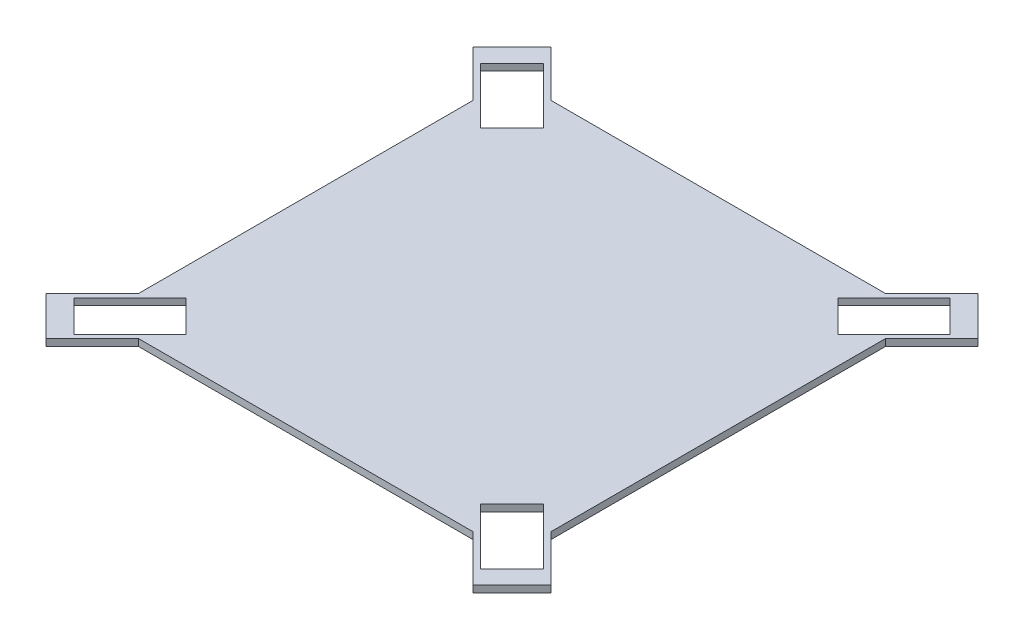
ISO-10303-21;
HEADER;
FILE_DESCRIPTION(('STEP AP214'),'2;1');
FILE_NAME('part.step','',(''),(''),'','','');
FILE_SCHEMA(('AUTOMOTIVE_DESIGN { 1 0 10303 214 1 1 1 1 }'));
ENDSEC;
DATA;
#1=APPLICATION_CONTEXT('core data for automotive mechanical design processes');
#2=APPLICATION_PROTOCOL_DEFINITION('international standard','automotive_design',2000,#1);
#3=PRODUCT_CONTEXT('',#1,'mechanical');
#4=PRODUCT('Part','Part','',(#3));
#5=PRODUCT_RELATED_PRODUCT_CATEGORY('part','',(#4));
#6=PRODUCT_DEFINITION_FORMATION('','',#4);
#7=PRODUCT_DEFINITION_CONTEXT('part definition',#1,'design');
#8=PRODUCT_DEFINITION('design','',#6,#7);
#9=PRODUCT_DEFINITION_SHAPE('','',#8);
#10=(LENGTH_UNIT() NAMED_UNIT(*) SI_UNIT(.MILLI.,.METRE.));
#11=(NAMED_UNIT(*) PLANE_ANGLE_UNIT() SI_UNIT($,.RADIAN.));
#12=(NAMED_UNIT(*) SI_UNIT($,.STERADIAN.) SOLID_ANGLE_UNIT());
#13=UNCERTAINTY_MEASURE_WITH_UNIT(LENGTH_MEASURE(1.E-05),#10,'distance_accuracy_value','');
#14=(GEOMETRIC_REPRESENTATION_CONTEXT(3) GLOBAL_UNCERTAINTY_ASSIGNED_CONTEXT((#13)) GLOBAL_UNIT_ASSIGNED_CONTEXT((#10,
#11,#12)) REPRESENTATION_CONTEXT('',''));
#15=CARTESIAN_POINT('',(0.,0.,0.));
#16=DIRECTION('',(0.,0.,1.));
#17=DIRECTION('',(1.,0.,0.));
#18=AXIS2_PLACEMENT_3D('',#15,#16,#17);
#19=CARTESIAN_POINT('',(0.,2.,0.));
#20=DIRECTION('',(0.,1.,0.));
#21=DIRECTION('',(0.,0.,1.));
#22=AXIS2_PLACEMENT_3D('',#19,#20,#21);
#23=PLANE('',#22);
#24=DIRECTION('',(-0.707106781186549,0.,0.707106781186546));
#25=VECTOR('',#24,1.);
#26=CARTESIAN_POINT('',(62.091199086055,2.,-73.4049075850395));
#27=LINE('',#26,#25);
#28=CARTESIAN_POINT('',(62.091199086055,2.,-73.4049075850395));
#29=VERTEX_POINT('',#28);
#30=CARTESIAN_POINT('',(48.6561702435106,2.,-59.9698787424951));
#31=VERTEX_POINT('',#30);
#32=EDGE_CURVE('E374',#29,#31,#27,.T.);
#33=ORIENTED_EDGE('',*,*,#32,.T.);
#34=DIRECTION('',(-1.,0.,0.));
#35=VECTOR('',#34,1.);
#36=CARTESIAN_POINT('',(48.6561702435106,2.,-59.9698787424951));
#37=LINE('',#36,#35);
#38=CARTESIAN_POINT('',(-48.6561702435106,2.,-59.9698787424951));
#39=VERTEX_POINT('',#38);
#40=EDGE_CURVE('E377',#31,#39,#37,.T.);
#41=ORIENTED_EDGE('',*,*,#40,.T.);
#42=DIRECTION('',(-0.707106781186549,0.,-0.707106781186546));
#43=VECTOR('',#42,1.);
#44=CARTESIAN_POINT('',(-62.091199086055,2.,-73.4049075850395));
#45=LINE('',#44,#43);
#46=CARTESIAN_POINT('',(-62.091199086055,2.,-73.4049075850395));
#47=VERTEX_POINT('',#46);
#48=EDGE_CURVE('E380',#39,#47,#45,.T.);
#49=ORIENTED_EDGE('',*,*,#48,.T.);
#50=DIRECTION('',(-0.707106781186546,0.,0.707106781186549));
#51=VECTOR('',#50,1.);
#52=CARTESIAN_POINT('',(-62.091199086055,2.,-73.4049075850395));
#53=LINE('',#52,#51);
#54=CARTESIAN_POINT('',(-73.4049075850398,2.,-62.0911990860547));
#55=VERTEX_POINT('',#54);
#56=EDGE_CURVE('E382',#47,#55,#53,.T.);
#57=ORIENTED_EDGE('',*,*,#56,.T.);
#58=DIRECTION('',(0.707106781186552,0.,0.707106781186543));
#59=VECTOR('',#58,1.);
#60=CARTESIAN_POINT('',(-73.4049075850398,2.,-62.0911990860547));
#61=LINE('',#60,#59);
#62=CARTESIAN_POINT('',(-59.9698787424953,2.,-48.6561702435104));
#63=VERTEX_POINT('',#62);
#64=EDGE_CURVE('E384',#55,#63,#61,.T.);
#65=ORIENTED_EDGE('',*,*,#64,.T.);
#66=DIRECTION('',(0.,0.,1.));
#67=VECTOR('',#66,1.);
#68=CARTESIAN_POINT('',(-59.9698787424953,2.,48.6561702435104));
#69=LINE('',#68,#67);
#70=CARTESIAN_POINT('',(-59.9698787424953,2.,48.6561702435104));
#71=VERTEX_POINT('',#70);
#72=EDGE_CURVE('E386',#63,#71,#69,.T.);
#73=ORIENTED_EDGE('',*,*,#72,.T.);
#74=DIRECTION('',(-0.707106781186552,0.,0.707106781186543));
#75=VECTOR('',#74,1.);
#76=CARTESIAN_POINT('',(-73.4049075850398,2.,62.0911990860547));
#77=LINE('',#76,#75);
#78=CARTESIAN_POINT('',(-73.4049075850398,2.,62.0911990860547));
#79=VERTEX_POINT('',#78);
#80=EDGE_CURVE('E388',#71,#79,#77,.T.);
#81=ORIENTED_EDGE('',*,*,#80,.T.);
#82=DIRECTION('',(0.707106781186546,0.,0.707106781186549));
#83=VECTOR('',#82,1.);
#84=CARTESIAN_POINT('',(-62.091199086055,2.,73.4049075850395));
#85=LINE('',#84,#83);
#86=CARTESIAN_POINT('',(-62.091199086055,2.,73.4049075850395));
#87=VERTEX_POINT('',#86);
#88=EDGE_CURVE('E390',#79,#87,#85,.T.);
#89=ORIENTED_EDGE('',*,*,#88,.T.);
#90=DIRECTION('',(0.707106781186549,0.,-0.707106781186546));
#91=VECTOR('',#90,1.);
#92=CARTESIAN_POINT('',(-62.091199086055,2.,73.4049075850395));
#93=LINE('',#92,#91);
#94=CARTESIAN_POINT('',(-48.6561702435106,2.,59.9698787424951));
#95=VERTEX_POINT('',#94);
#96=EDGE_CURVE('E392',#87,#95,#93,.T.);
#97=ORIENTED_EDGE('',*,*,#96,.T.);
#98=DIRECTION('',(1.,0.,0.));
#99=VECTOR('',#98,1.);
#100=CARTESIAN_POINT('',(48.6561702435106,2.,59.9698787424951));
#101=LINE('',#100,#99);
#102=CARTESIAN_POINT('',(48.6561702435106,2.,59.9698787424951));
#103=VERTEX_POINT('',#102);
#104=EDGE_CURVE('E394',#95,#103,#101,.T.);
#105=ORIENTED_EDGE('',*,*,#104,.T.);
#106=DIRECTION('',(0.707106781186549,0.,0.707106781186546));
#107=VECTOR('',#106,1.);
#108=CARTESIAN_POINT('',(62.091199086055,2.,73.4049075850395));
#109=LINE('',#108,#107);
#110=CARTESIAN_POINT('',(62.091199086055,2.,73.4049075850395));
#111=VERTEX_POINT('',#110);
#112=EDGE_CURVE('E396',#103,#111,#109,.T.);
#113=ORIENTED_EDGE('',*,*,#112,.T.);
#114=DIRECTION('',(0.707106781186546,0.,-0.707106781186549));
#115=VECTOR('',#114,1.);
#116=CARTESIAN_POINT('',(62.091199086055,2.,73.4049075850395));
#117=LINE('',#116,#115);
#118=CARTESIAN_POINT('',(73.4049075850398,2.,62.0911990860547));
#119=VERTEX_POINT('',#118);
#120=EDGE_CURVE('E398',#111,#119,#117,.T.);
#121=ORIENTED_EDGE('',*,*,#120,.T.);
#122=DIRECTION('',(-0.707106781186552,0.,-0.707106781186543));
#123=VECTOR('',#122,1.);
#124=CARTESIAN_POINT('',(73.4049075850398,2.,62.0911990860547));
#125=LINE('',#124,#123);
#126=CARTESIAN_POINT('',(59.9698787424953,2.,48.6561702435104));
#127=VERTEX_POINT('',#126);
#128=EDGE_CURVE('E400',#119,#127,#125,.T.);
#129=ORIENTED_EDGE('',*,*,#128,.T.);
#130=DIRECTION('',(0.,0.,-1.));
#131=VECTOR('',#130,1.);
#132=CARTESIAN_POINT('',(59.9698787424953,2.,48.6561702435104));
#133=LINE('',#132,#131);
#134=CARTESIAN_POINT('',(59.9698787424954,2.,-48.6561702435103));
#135=VERTEX_POINT('',#134);
#136=EDGE_CURVE('E402',#127,#135,#133,.T.);
#137=ORIENTED_EDGE('',*,*,#136,.T.);
#138=DIRECTION('',(0.707106781186547,0.,-0.707106781186547));
#139=VECTOR('',#138,1.);
#140=CARTESIAN_POINT('',(73.4049075850398,2.,-62.0911990860547));
#141=LINE('',#140,#139);
#142=CARTESIAN_POINT('',(73.4049075850398,2.,-62.0911990860547));
#143=VERTEX_POINT('',#142);
#144=EDGE_CURVE('E404',#135,#143,#141,.T.);
#145=ORIENTED_EDGE('',*,*,#144,.T.);
#146=DIRECTION('',(-0.707106781186546,0.,-0.707106781186549));
#147=VECTOR('',#146,1.);
#148=CARTESIAN_POINT('',(62.091199086055,2.,-73.4049075850395));
#149=LINE('',#148,#147);
#150=EDGE_CURVE('E406',#143,#29,#149,.T.);
#151=ORIENTED_EDGE('',*,*,#150,.T.);
#152=EDGE_LOOP('',(#33,#41,#49,#57,#65,#73,#81,#89,#97,#105,#113,#121,#129,#137,#145,#151));
#153=FACE_BOUND('',#152,.T.);
#154=DIRECTION('',(0.707106781186546,0.,0.707106781186549));
#155=VECTOR('',#154,1.);
#156=CARTESIAN_POINT('',(42.7871839596622,2.,-51.9795721150871));
#157=LINE('',#156,#155);
#158=CARTESIAN_POINT('',(42.7871839596622,2.,-51.9795721150871));
#159=VERTEX_POINT('',#158);
#160=CARTESIAN_POINT('',(51.9795721150873,2.,-42.787183959662));
#161=VERTEX_POINT('',#160);
#162=EDGE_CURVE('E345',#159,#161,#157,.T.);
#163=ORIENTED_EDGE('',*,*,#162,.F.);
#164=DIRECTION('',(-0.70710678118655,0.,0.707106781186545));
#165=VECTOR('',#164,1.);
#166=CARTESIAN_POINT('',(59.0506399269529,2.,-68.2430280823776));
#167=LINE('',#166,#165);
#168=CARTESIAN_POINT('',(59.0506399269529,2.,-68.2430280823776));
#169=VERTEX_POINT('',#168);
#170=EDGE_CURVE('E343',#169,#159,#167,.T.);
#171=ORIENTED_EDGE('',*,*,#170,.F.);
#172=DIRECTION('',(-0.707106781186547,0.,-0.707106781186548));
#173=VECTOR('',#172,1.);
#174=CARTESIAN_POINT('',(59.0506399269529,2.,-68.2430280823776));
#175=LINE('',#174,#173);
#176=CARTESIAN_POINT('',(68.2430280823779,2.,-59.0506399269526));
#177=VERTEX_POINT('',#176);
#178=EDGE_CURVE('E351',#177,#169,#175,.T.);
#179=ORIENTED_EDGE('',*,*,#178,.F.);
#180=DIRECTION('',(0.707106781186548,0.,-0.707106781186547));
#181=VECTOR('',#180,1.);
#182=CARTESIAN_POINT('',(68.2430280823779,2.,-59.0506399269526));
#183=LINE('',#182,#181);
#184=EDGE_CURVE('E348',#161,#177,#183,.T.);
#185=ORIENTED_EDGE('',*,*,#184,.F.);
#186=EDGE_LOOP('',(#163,#171,#179,#185));
#187=FACE_BOUND('',#186,.T.);
#188=DIRECTION('',(-0.707106781186548,0.,-0.707106781186547));
#189=VECTOR('',#188,1.);
#190=CARTESIAN_POINT('',(68.2430280823779,2.,59.0506399269526));
#191=LINE('',#190,#189);
#192=CARTESIAN_POINT('',(68.2430280823779,2.,59.0506399269526));
#193=VERTEX_POINT('',#192);
#194=CARTESIAN_POINT('',(51.9795721150873,2.,42.787183959662));
#195=VERTEX_POINT('',#194);
#196=EDGE_CURVE('E314',#193,#195,#191,.T.);
#197=ORIENTED_EDGE('',*,*,#196,.F.);
#198=DIRECTION('',(0.707106781186547,0.,-0.707106781186548));
#199=VECTOR('',#198,1.);
#200=CARTESIAN_POINT('',(59.0506399269529,2.,68.2430280823776));
#201=LINE('',#200,#199);
#202=CARTESIAN_POINT('',(59.0506399269529,2.,68.2430280823776));
#203=VERTEX_POINT('',#202);
#204=EDGE_CURVE('E312',#203,#193,#201,.T.);
#205=ORIENTED_EDGE('',*,*,#204,.F.);
#206=DIRECTION('',(0.70710678118655,0.,0.707106781186545));
#207=VECTOR('',#206,1.);
#208=CARTESIAN_POINT('',(59.0506399269529,2.,68.2430280823776));
#209=LINE('',#208,#207);
#210=CARTESIAN_POINT('',(42.7871839596622,2.,51.9795721150871));
#211=VERTEX_POINT('',#210);
#212=EDGE_CURVE('E320',#211,#203,#209,.T.);
#213=ORIENTED_EDGE('',*,*,#212,.F.);
#214=DIRECTION('',(-0.707106781186546,0.,0.707106781186549));
#215=VECTOR('',#214,1.);
#216=CARTESIAN_POINT('',(42.7871839596622,2.,51.9795721150871));
#217=LINE('',#216,#215);
#218=EDGE_CURVE('E317',#195,#211,#217,.T.);
#219=ORIENTED_EDGE('',*,*,#218,.F.);
#220=EDGE_LOOP('',(#197,#205,#213,#219));
#221=FACE_BOUND('',#220,.T.);
#222=DIRECTION('',(-0.707106781186546,0.,-0.707106781186549));
#223=VECTOR('',#222,1.);
#224=CARTESIAN_POINT('',(-42.7871839596622,2.,51.9795721150871));
#225=LINE('',#224,#223);
#226=CARTESIAN_POINT('',(-42.7871839596622,2.,51.9795721150871));
#227=VERTEX_POINT('',#226);
#228=CARTESIAN_POINT('',(-51.9795721150873,2.,42.787183959662));
#229=VERTEX_POINT('',#228);
#230=EDGE_CURVE('E283',#227,#229,#225,.T.);
#231=ORIENTED_EDGE('',*,*,#230,.F.);
#232=DIRECTION('',(0.70710678118655,0.,-0.707106781186545));
#233=VECTOR('',#232,1.);
#234=CARTESIAN_POINT('',(-59.0506399269529,2.,68.2430280823776));
#235=LINE('',#234,#233);
#236=CARTESIAN_POINT('',(-59.0506399269529,2.,68.2430280823776));
#237=VERTEX_POINT('',#236);
#238=EDGE_CURVE('E281',#237,#227,#235,.T.);
#239=ORIENTED_EDGE('',*,*,#238,.F.);
#240=DIRECTION('',(0.707106781186547,0.,0.707106781186548));
#241=VECTOR('',#240,1.);
#242=CARTESIAN_POINT('',(-59.0506399269529,2.,68.2430280823776));
#243=LINE('',#242,#241);
#244=CARTESIAN_POINT('',(-68.2430280823779,2.,59.0506399269526));
#245=VERTEX_POINT('',#244);
#246=EDGE_CURVE('E289',#245,#237,#243,.T.);
#247=ORIENTED_EDGE('',*,*,#246,.F.);
#248=DIRECTION('',(-0.707106781186548,0.,0.707106781186547));
#249=VECTOR('',#248,1.);
#250=CARTESIAN_POINT('',(-68.2430280823779,2.,59.0506399269526));
#251=LINE('',#250,#249);
#252=EDGE_CURVE('E286',#229,#245,#251,.T.);
#253=ORIENTED_EDGE('',*,*,#252,.F.);
#254=EDGE_LOOP('',(#231,#239,#247,#253));
#255=FACE_BOUND('',#254,.T.);
#256=DIRECTION('',(0.707106781186548,0.,0.707106781186547));
#257=VECTOR('',#256,1.);
#258=CARTESIAN_POINT('',(-68.2430280823779,2.,-59.0506399269526));
#259=LINE('',#258,#257);
#260=CARTESIAN_POINT('',(-68.2430280823779,2.,-59.0506399269526));
#261=VERTEX_POINT('',#260);
#262=CARTESIAN_POINT('',(-51.9795721150873,2.,-42.787183959662));
#263=VERTEX_POINT('',#262);
#264=EDGE_CURVE('E253',#261,#263,#259,.T.);
#265=ORIENTED_EDGE('',*,*,#264,.F.);
#266=DIRECTION('',(-0.707106781186547,0.,0.707106781186548));
#267=VECTOR('',#266,1.);
#268=CARTESIAN_POINT('',(-59.0506399269529,2.,-68.2430280823776));
#269=LINE('',#268,#267);
#270=CARTESIAN_POINT('',(-59.0506399269529,2.,-68.2430280823776));
#271=VERTEX_POINT('',#270);
#272=EDGE_CURVE('E245',#271,#261,#269,.T.);
#273=ORIENTED_EDGE('',*,*,#272,.F.);
#274=DIRECTION('',(-0.70710678118655,0.,-0.707106781186545));
#275=VECTOR('',#274,1.);
#276=CARTESIAN_POINT('',(-59.0506399269529,2.,-68.2430280823776));
#277=LINE('',#276,#275);
#278=CARTESIAN_POINT('',(-42.7871839596622,2.,-51.9795721150871));
#279=VERTEX_POINT('',#278);
#280=EDGE_CURVE('E267',#279,#271,#277,.T.);
#281=ORIENTED_EDGE('',*,*,#280,.F.);
#282=DIRECTION('',(0.707106781186546,0.,-0.707106781186549));
#283=VECTOR('',#282,1.);
#284=CARTESIAN_POINT('',(-42.7871839596622,2.,-51.9795721150871));
#285=LINE('',#284,#283);
#286=EDGE_CURVE('E265',#263,#279,#285,.T.);
#287=ORIENTED_EDGE('',*,*,#286,.F.);
#288=EDGE_LOOP('',(#265,#273,#281,#287));
#289=FACE_BOUND('',#288,.T.);
#290=ADVANCED_FACE('F36',(#153,#187,#221,#255,#289),#23,.T.);
#291=CARTESIAN_POINT('',(0.,0.,0.));
#292=DIRECTION('',(0.,1.,0.));
#293=DIRECTION('',(0.,0.,1.));
#294=AXIS2_PLACEMENT_3D('',#291,#292,#293);
#295=PLANE('',#294);
#296=DIRECTION('',(0.70710678118655,0.,-0.707106781186545));
#297=VECTOR('',#296,1.);
#298=CARTESIAN_POINT('',(-59.0506399269529,0.,68.2430280823776));
#299=LINE('',#298,#297);
#300=CARTESIAN_POINT('',(-59.0506399269529,0.,68.2430280823776));
#301=VERTEX_POINT('',#300);
#302=CARTESIAN_POINT('',(-42.7871839596622,0.,51.9795721150871));
#303=VERTEX_POINT('',#302);
#304=EDGE_CURVE('E261',#301,#303,#299,.T.);
#305=ORIENTED_EDGE('',*,*,#304,.T.);
#306=DIRECTION('',(-0.707106781186546,0.,-0.707106781186549));
#307=VECTOR('',#306,1.);
#308=CARTESIAN_POINT('',(-42.7871839596622,0.,51.9795721150871));
#309=LINE('',#308,#307);
#310=CARTESIAN_POINT('',(-51.9795721150873,0.,42.787183959662));
#311=VERTEX_POINT('',#310);
#312=EDGE_CURVE('E294',#303,#311,#309,.T.);
#313=ORIENTED_EDGE('',*,*,#312,.T.);
#314=DIRECTION('',(-0.707106781186548,0.,0.707106781186547));
#315=VECTOR('',#314,1.);
#316=CARTESIAN_POINT('',(-68.2430280823779,0.,59.0506399269526));
#317=LINE('',#316,#315);
#318=CARTESIAN_POINT('',(-68.2430280823779,0.,59.0506399269526));
#319=VERTEX_POINT('',#318);
#320=EDGE_CURVE('E297',#311,#319,#317,.T.);
#321=ORIENTED_EDGE('',*,*,#320,.T.);
#322=DIRECTION('',(0.707106781186547,0.,0.707106781186548));
#323=VECTOR('',#322,1.);
#324=CARTESIAN_POINT('',(-59.0506399269529,0.,68.2430280823776));
#325=LINE('',#324,#323);
#326=EDGE_CURVE('E284',#319,#301,#325,.T.);
#327=ORIENTED_EDGE('',*,*,#326,.T.);
#328=EDGE_LOOP('',(#305,#313,#321,#327));
#329=FACE_BOUND('',#328,.T.);
#330=DIRECTION('',(-0.70710678118655,0.,0.707106781186545));
#331=VECTOR('',#330,1.);
#332=CARTESIAN_POINT('',(59.0506399269529,0.,-68.2430280823776));
#333=LINE('',#332,#331);
#334=CARTESIAN_POINT('',(59.0506399269529,0.,-68.2430280823776));
#335=VERTEX_POINT('',#334);
#336=CARTESIAN_POINT('',(42.7871839596622,0.,-51.9795721150871));
#337=VERTEX_POINT('',#336);
#338=EDGE_CURVE('E342',#335,#337,#333,.T.);
#339=ORIENTED_EDGE('',*,*,#338,.T.);
#340=DIRECTION('',(0.707106781186546,0.,0.707106781186549));
#341=VECTOR('',#340,1.);
#342=CARTESIAN_POINT('',(42.7871839596622,0.,-51.9795721150871));
#343=LINE('',#342,#341);
#344=CARTESIAN_POINT('',(51.9795721150873,0.,-42.787183959662));
#345=VERTEX_POINT('',#344);
#346=EDGE_CURVE('E356',#337,#345,#343,.T.);
#347=ORIENTED_EDGE('',*,*,#346,.T.);
#348=DIRECTION('',(0.707106781186548,0.,-0.707106781186547));
#349=VECTOR('',#348,1.);
#350=CARTESIAN_POINT('',(68.2430280823779,0.,-59.0506399269526));
#351=LINE('',#350,#349);
#352=CARTESIAN_POINT('',(68.2430280823779,0.,-59.0506399269526));
#353=VERTEX_POINT('',#352);
#354=EDGE_CURVE('E359',#345,#353,#351,.T.);
#355=ORIENTED_EDGE('',*,*,#354,.T.);
#356=DIRECTION('',(-0.707106781186547,0.,-0.707106781186548));
#357=VECTOR('',#356,1.);
#358=CARTESIAN_POINT('',(59.0506399269529,0.,-68.2430280823776));
#359=LINE('',#358,#357);
#360=EDGE_CURVE('E346',#353,#335,#359,.T.);
#361=ORIENTED_EDGE('',*,*,#360,.T.);
#362=EDGE_LOOP('',(#339,#347,#355,#361));
#363=FACE_BOUND('',#362,.T.);
#364=DIRECTION('',(-0.707106781186549,0.,0.707106781186546));
#365=VECTOR('',#364,1.);
#366=CARTESIAN_POINT('',(62.091199086055,0.,-73.4049075850395));
#367=LINE('',#366,#365);
#368=CARTESIAN_POINT('',(62.091199086055,0.,-73.4049075850395));
#369=VERTEX_POINT('',#368);
#370=CARTESIAN_POINT('',(48.6561702435106,0.,-59.9698787424951));
#371=VERTEX_POINT('',#370);
#372=EDGE_CURVE('E373',#369,#371,#367,.T.);
#373=ORIENTED_EDGE('',*,*,#372,.F.);
#374=DIRECTION('',(-0.707106781186546,0.,-0.707106781186549));
#375=VECTOR('',#374,1.);
#376=CARTESIAN_POINT('',(62.091199086055,0.,-73.4049075850395));
#377=LINE('',#376,#375);
#378=CARTESIAN_POINT('',(73.4049075850398,0.,-62.0911990860547));
#379=VERTEX_POINT('',#378);
#380=EDGE_CURVE('E378',#379,#369,#377,.T.);
#381=ORIENTED_EDGE('',*,*,#380,.F.);
#382=DIRECTION('',(0.707106781186547,0.,-0.707106781186547));
#383=VECTOR('',#382,1.);
#384=CARTESIAN_POINT('',(73.4049075850398,0.,-62.0911990860547));
#385=LINE('',#384,#383);
#386=CARTESIAN_POINT('',(59.9698787424954,0.,-48.6561702435103));
#387=VERTEX_POINT('',#386);
#388=EDGE_CURVE('E437',#387,#379,#385,.T.);
#389=ORIENTED_EDGE('',*,*,#388,.F.);
#390=DIRECTION('',(0.,0.,-1.));
#391=VECTOR('',#390,1.);
#392=CARTESIAN_POINT('',(59.9698787424953,0.,48.6561702435104));
#393=LINE('',#392,#391);
#394=CARTESIAN_POINT('',(59.9698787424953,0.,48.6561702435104));
#395=VERTEX_POINT('',#394);
#396=EDGE_CURVE('E435',#395,#387,#393,.T.);
#397=ORIENTED_EDGE('',*,*,#396,.F.);
#398=DIRECTION('',(-0.707106781186552,0.,-0.707106781186543));
#399=VECTOR('',#398,1.);
#400=CARTESIAN_POINT('',(73.4049075850398,0.,62.0911990860547));
#401=LINE('',#400,#399);
#402=CARTESIAN_POINT('',(73.4049075850398,0.,62.0911990860547));
#403=VERTEX_POINT('',#402);
#404=EDGE_CURVE('E433',#403,#395,#401,.T.);
#405=ORIENTED_EDGE('',*,*,#404,.F.);
#406=DIRECTION('',(0.707106781186546,0.,-0.707106781186549));
#407=VECTOR('',#406,1.);
#408=CARTESIAN_POINT('',(62.091199086055,0.,73.4049075850395));
#409=LINE('',#408,#407);
#410=CARTESIAN_POINT('',(62.091199086055,0.,73.4049075850395));
#411=VERTEX_POINT('',#410);
#412=EDGE_CURVE('E431',#411,#403,#409,.T.);
#413=ORIENTED_EDGE('',*,*,#412,.F.);
#414=DIRECTION('',(0.707106781186549,0.,0.707106781186546));
#415=VECTOR('',#414,1.);
#416=CARTESIAN_POINT('',(62.091199086055,0.,73.4049075850395));
#417=LINE('',#416,#415);
#418=CARTESIAN_POINT('',(48.6561702435106,0.,59.9698787424951));
#419=VERTEX_POINT('',#418);
#420=EDGE_CURVE('E429',#419,#411,#417,.T.);
#421=ORIENTED_EDGE('',*,*,#420,.F.);
#422=DIRECTION('',(1.,0.,0.));
#423=VECTOR('',#422,1.);
#424=CARTESIAN_POINT('',(48.6561702435106,0.,59.9698787424951));
#425=LINE('',#424,#423);
#426=CARTESIAN_POINT('',(-48.6561702435106,0.,59.9698787424951));
#427=VERTEX_POINT('',#426);
#428=EDGE_CURVE('E427',#427,#419,#425,.T.);
#429=ORIENTED_EDGE('',*,*,#428,.F.);
#430=DIRECTION('',(0.707106781186549,0.,-0.707106781186546));
#431=VECTOR('',#430,1.);
#432=CARTESIAN_POINT('',(-62.091199086055,0.,73.4049075850395));
#433=LINE('',#432,#431);
#434=CARTESIAN_POINT('',(-62.091199086055,0.,73.4049075850395));
#435=VERTEX_POINT('',#434);
#436=EDGE_CURVE('E425',#435,#427,#433,.T.);
#437=ORIENTED_EDGE('',*,*,#436,.F.);
#438=DIRECTION('',(0.707106781186546,0.,0.707106781186549));
#439=VECTOR('',#438,1.);
#440=CARTESIAN_POINT('',(-62.091199086055,0.,73.4049075850395));
#441=LINE('',#440,#439);
#442=CARTESIAN_POINT('',(-73.4049075850398,0.,62.0911990860547));
#443=VERTEX_POINT('',#442);
#444=EDGE_CURVE('E423',#443,#435,#441,.T.);
#445=ORIENTED_EDGE('',*,*,#444,.F.);
#446=DIRECTION('',(-0.707106781186552,0.,0.707106781186543));
#447=VECTOR('',#446,1.);
#448=CARTESIAN_POINT('',(-73.4049075850398,0.,62.0911990860547));
#449=LINE('',#448,#447);
#450=CARTESIAN_POINT('',(-59.9698787424953,0.,48.6561702435104));
#451=VERTEX_POINT('',#450);
#452=EDGE_CURVE('E421',#451,#443,#449,.T.);
#453=ORIENTED_EDGE('',*,*,#452,.F.);
#454=DIRECTION('',(0.,0.,1.));
#455=VECTOR('',#454,1.);
#456=CARTESIAN_POINT('',(-59.9698787424953,0.,48.6561702435104));
#457=LINE('',#456,#455);
#458=CARTESIAN_POINT('',(-59.9698787424953,0.,-48.6561702435104));
#459=VERTEX_POINT('',#458);
#460=EDGE_CURVE('E419',#459,#451,#457,.T.);
#461=ORIENTED_EDGE('',*,*,#460,.F.);
#462=DIRECTION('',(0.707106781186552,0.,0.707106781186543));
#463=VECTOR('',#462,1.);
#464=CARTESIAN_POINT('',(-73.4049075850398,0.,-62.0911990860547));
#465=LINE('',#464,#463);
#466=CARTESIAN_POINT('',(-73.4049075850398,0.,-62.0911990860547));
#467=VERTEX_POINT('',#466);
#468=EDGE_CURVE('E417',#467,#459,#465,.T.);
#469=ORIENTED_EDGE('',*,*,#468,.F.);
#470=DIRECTION('',(-0.707106781186546,0.,0.707106781186549));
#471=VECTOR('',#470,1.);
#472=CARTESIAN_POINT('',(-62.091199086055,0.,-73.4049075850395));
#473=LINE('',#472,#471);
#474=CARTESIAN_POINT('',(-62.091199086055,0.,-73.4049075850395));
#475=VERTEX_POINT('',#474);
#476=EDGE_CURVE('E415',#475,#467,#473,.T.);
#477=ORIENTED_EDGE('',*,*,#476,.F.);
#478=DIRECTION('',(-0.707106781186549,0.,-0.707106781186546));
#479=VECTOR('',#478,1.);
#480=CARTESIAN_POINT('',(-62.091199086055,0.,-73.4049075850395));
#481=LINE('',#480,#479);
#482=CARTESIAN_POINT('',(-48.6561702435106,0.,-59.9698787424951));
#483=VERTEX_POINT('',#482);
#484=EDGE_CURVE('E413',#483,#475,#481,.T.);
#485=ORIENTED_EDGE('',*,*,#484,.F.);
#486=DIRECTION('',(-1.,0.,0.));
#487=VECTOR('',#486,1.);
#488=CARTESIAN_POINT('',(48.6561702435106,0.,-59.9698787424951));
#489=LINE('',#488,#487);
#490=EDGE_CURVE('E411',#371,#483,#489,.T.);
#491=ORIENTED_EDGE('',*,*,#490,.F.);
#492=EDGE_LOOP('',(#373,#381,#389,#397,#405,#413,#421,#429,#437,#445,#453,#461,#469,#477,#485,#491));
#493=FACE_BOUND('',#492,.T.);
#494=DIRECTION('',(0.707106781186547,0.,-0.707106781186548));
#495=VECTOR('',#494,1.);
#496=CARTESIAN_POINT('',(59.0506399269529,0.,68.2430280823776));
#497=LINE('',#496,#495);
#498=CARTESIAN_POINT('',(59.0506399269529,0.,68.2430280823776));
#499=VERTEX_POINT('',#498);
#500=CARTESIAN_POINT('',(68.2430280823779,0.,59.0506399269526));
#501=VERTEX_POINT('',#500);
#502=EDGE_CURVE('E311',#499,#501,#497,.T.);
#503=ORIENTED_EDGE('',*,*,#502,.T.);
#504=DIRECTION('',(-0.707106781186548,0.,-0.707106781186547));
#505=VECTOR('',#504,1.);
#506=CARTESIAN_POINT('',(68.2430280823779,0.,59.0506399269526));
#507=LINE('',#506,#505);
#508=CARTESIAN_POINT('',(51.9795721150873,0.,42.787183959662));
#509=VERTEX_POINT('',#508);
#510=EDGE_CURVE('E325',#501,#509,#507,.T.);
#511=ORIENTED_EDGE('',*,*,#510,.T.);
#512=DIRECTION('',(-0.707106781186546,0.,0.707106781186549));
#513=VECTOR('',#512,1.);
#514=CARTESIAN_POINT('',(42.7871839596622,0.,51.9795721150871));
#515=LINE('',#514,#513);
#516=CARTESIAN_POINT('',(42.7871839596622,0.,51.9795721150871));
#517=VERTEX_POINT('',#516);
#518=EDGE_CURVE('E328',#509,#517,#515,.T.);
#519=ORIENTED_EDGE('',*,*,#518,.T.);
#520=DIRECTION('',(0.70710678118655,0.,0.707106781186545));
#521=VECTOR('',#520,1.);
#522=CARTESIAN_POINT('',(59.0506399269529,0.,68.2430280823776));
#523=LINE('',#522,#521);
#524=EDGE_CURVE('E315',#517,#499,#523,.T.);
#525=ORIENTED_EDGE('',*,*,#524,.T.);
#526=EDGE_LOOP('',(#503,#511,#519,#525));
#527=FACE_BOUND('',#526,.T.);
#528=DIRECTION('',(-0.707106781186547,0.,0.707106781186548));
#529=VECTOR('',#528,1.);
#530=CARTESIAN_POINT('',(-59.0506399269529,0.,-68.2430280823776));
#531=LINE('',#530,#529);
#532=CARTESIAN_POINT('',(-59.0506399269529,0.,-68.2430280823776));
#533=VERTEX_POINT('',#532);
#534=CARTESIAN_POINT('',(-68.2430280823779,0.,-59.0506399269526));
#535=VERTEX_POINT('',#534);
#536=EDGE_CURVE('E59',#533,#535,#531,.T.);
#537=ORIENTED_EDGE('',*,*,#536,.T.);
#538=DIRECTION('',(0.707106781186548,0.,0.707106781186547));
#539=VECTOR('',#538,1.);
#540=CARTESIAN_POINT('',(-68.2430280823779,0.,-59.0506399269526));
#541=LINE('',#540,#539);
#542=CARTESIAN_POINT('',(-51.9795721150873,0.,-42.787183959662));
#543=VERTEX_POINT('',#542);
#544=EDGE_CURVE('E260',#535,#543,#541,.T.);
#545=ORIENTED_EDGE('',*,*,#544,.T.);
#546=DIRECTION('',(0.707106781186546,0.,-0.707106781186549));
#547=VECTOR('',#546,1.);
#548=CARTESIAN_POINT('',(-42.7871839596622,0.,-51.9795721150871));
#549=LINE('',#548,#547);
#550=CARTESIAN_POINT('',(-42.7871839596622,0.,-51.9795721150871));
#551=VERTEX_POINT('',#550);
#552=EDGE_CURVE('E273',#543,#551,#549,.T.);
#553=ORIENTED_EDGE('',*,*,#552,.T.);
#554=DIRECTION('',(-0.70710678118655,0.,-0.707106781186545));
#555=VECTOR('',#554,1.);
#556=CARTESIAN_POINT('',(-59.0506399269529,0.,-68.2430280823776));
#557=LINE('',#556,#555);
#558=EDGE_CURVE('E254',#551,#533,#557,.T.);
#559=ORIENTED_EDGE('',*,*,#558,.T.);
#560=EDGE_LOOP('',(#537,#545,#553,#559));
#561=FACE_BOUND('',#560,.T.);
#562=ADVANCED_FACE('F491',(#329,#363,#493,#527,#561),#295,.F.);
#563=CARTESIAN_POINT('',(62.091199086055,2.,-73.4049075850395));
#564=DIRECTION('',(0.707106781186546,0.,0.707106781186549));
#565=DIRECTION('',(0.707106781186549,0.,-0.707106781186546));
#566=AXIS2_PLACEMENT_3D('',#563,#564,#565);
#567=PLANE('',#566);
#568=ORIENTED_EDGE('',*,*,#372,.T.);
#569=DIRECTION('',(0.,-1.,0.));
#570=VECTOR('',#569,1.);
#571=CARTESIAN_POINT('',(48.6561702435106,2.,-59.9698787424951));
#572=LINE('',#571,#570);
#573=EDGE_CURVE('E11',#31,#371,#572,.T.);
#574=ORIENTED_EDGE('',*,*,#573,.F.);
#575=ORIENTED_EDGE('',*,*,#32,.F.);
#576=DIRECTION('',(0.,-1.,0.));
#577=VECTOR('',#576,1.);
#578=CARTESIAN_POINT('',(62.091199086055,2.,-73.4049075850395));
#579=LINE('',#578,#577);
#580=EDGE_CURVE('E408',#29,#369,#579,.T.);
#581=ORIENTED_EDGE('',*,*,#580,.T.);
#582=EDGE_LOOP('',(#568,#574,#575,#581));
#583=FACE_BOUND('',#582,.T.);
#584=ADVANCED_FACE('F38',(#583),#567,.F.);
#585=CARTESIAN_POINT('',(48.6561702435106,2.,-59.9698787424951));
#586=DIRECTION('',(0.,0.,1.));
#587=DIRECTION('',(1.,0.,0.));
#588=AXIS2_PLACEMENT_3D('',#585,#586,#587);
#589=PLANE('',#588);
#590=ORIENTED_EDGE('',*,*,#490,.T.);
#591=DIRECTION('',(0.,-1.,0.));
#592=VECTOR('',#591,1.);
#593=CARTESIAN_POINT('',(-48.6561702435106,2.,-59.9698787424951));
#594=LINE('',#593,#592);
#595=EDGE_CURVE('E44',#39,#483,#594,.T.);
#596=ORIENTED_EDGE('',*,*,#595,.F.);
#597=ORIENTED_EDGE('',*,*,#40,.F.);
#598=ORIENTED_EDGE('',*,*,#573,.T.);
#599=EDGE_LOOP('',(#590,#596,#597,#598));
#600=FACE_BOUND('',#599,.T.);
#601=ADVANCED_FACE('F509',(#600),#589,.F.);
#602=CARTESIAN_POINT('',(-62.091199086055,2.,-73.4049075850395));
#603=DIRECTION('',(-0.707106781186546,0.,0.707106781186549));
#604=DIRECTION('',(0.707106781186549,0.,0.707106781186546));
#605=AXIS2_PLACEMENT_3D('',#602,#603,#604);
#606=PLANE('',#605);
#607=ORIENTED_EDGE('',*,*,#484,.T.);
#608=DIRECTION('',(0.,-1.,0.));
#609=VECTOR('',#608,1.);
#610=CARTESIAN_POINT('',(-62.091199086055,2.,-73.4049075850395));
#611=LINE('',#610,#609);
#612=EDGE_CURVE('E478',#47,#475,#611,.T.);
#613=ORIENTED_EDGE('',*,*,#612,.F.);
#614=ORIENTED_EDGE('',*,*,#48,.F.);
#615=ORIENTED_EDGE('',*,*,#595,.T.);
#616=EDGE_LOOP('',(#607,#613,#614,#615));
#617=FACE_BOUND('',#616,.T.);
#618=ADVANCED_FACE('F485',(#617),#606,.F.);
#619=CARTESIAN_POINT('',(-62.091199086055,2.,-73.4049075850395));
#620=DIRECTION('',(0.707106781186549,0.,0.707106781186546));
#621=DIRECTION('',(0.707106781186546,0.,-0.707106781186549));
#622=AXIS2_PLACEMENT_3D('',#619,#620,#621);
#623=PLANE('',#622);
#624=ORIENTED_EDGE('',*,*,#476,.T.);
#625=DIRECTION('',(0.,-1.,0.));
#626=VECTOR('',#625,1.);
#627=CARTESIAN_POINT('',(-73.4049075850398,2.,-62.0911990860547));
#628=LINE('',#627,#626);
#629=EDGE_CURVE('E475',#55,#467,#628,.T.);
#630=ORIENTED_EDGE('',*,*,#629,.F.);
#631=ORIENTED_EDGE('',*,*,#56,.F.);
#632=ORIENTED_EDGE('',*,*,#612,.T.);
#633=EDGE_LOOP('',(#624,#630,#631,#632));
#634=FACE_BOUND('',#633,.T.);
#635=ADVANCED_FACE('F497',(#634),#623,.F.);
#636=CARTESIAN_POINT('',(-73.4049075850398,2.,-62.0911990860547));
#637=DIRECTION('',(0.707106781186543,0.,-0.707106781186552));
#638=DIRECTION('',(-0.707106781186552,0.,-0.707106781186543));
#639=AXIS2_PLACEMENT_3D('',#636,#637,#638);
#640=PLANE('',#639);
#641=ORIENTED_EDGE('',*,*,#468,.T.);
#642=DIRECTION('',(0.,-1.,0.));
#643=VECTOR('',#642,1.);
#644=CARTESIAN_POINT('',(-59.9698787424953,2.,-48.6561702435104));
#645=LINE('',#644,#643);
#646=EDGE_CURVE('E472',#63,#459,#645,.T.);
#647=ORIENTED_EDGE('',*,*,#646,.F.);
#648=ORIENTED_EDGE('',*,*,#64,.F.);
#649=ORIENTED_EDGE('',*,*,#629,.T.);
#650=EDGE_LOOP('',(#641,#647,#648,#649));
#651=FACE_BOUND('',#650,.T.);
#652=ADVANCED_FACE('F501',(#651),#640,.F.);
#653=CARTESIAN_POINT('',(-59.9698787424953,2.,48.6561702435104));
#654=DIRECTION('',(1.,0.,0.));
#655=DIRECTION('',(0.,0.,-1.));
#656=AXIS2_PLACEMENT_3D('',#653,#654,#655);
#657=PLANE('',#656);
#658=ORIENTED_EDGE('',*,*,#460,.T.);
#659=DIRECTION('',(0.,-1.,0.));
#660=VECTOR('',#659,1.);
#661=CARTESIAN_POINT('',(-59.9698787424953,2.,48.6561702435104));
#662=LINE('',#661,#660);
#663=EDGE_CURVE('E469',#71,#451,#662,.T.);
#664=ORIENTED_EDGE('',*,*,#663,.F.);
#665=ORIENTED_EDGE('',*,*,#72,.F.);
#666=ORIENTED_EDGE('',*,*,#646,.T.);
#667=EDGE_LOOP('',(#658,#664,#665,#666));
#668=FACE_BOUND('',#667,.T.);
#669=ADVANCED_FACE('F562',(#668),#657,.F.);
#670=CARTESIAN_POINT('',(-73.4049075850398,2.,62.0911990860547));
#671=DIRECTION('',(0.707106781186543,0.,0.707106781186552));
#672=DIRECTION('',(0.707106781186552,0.,-0.707106781186543));
#673=AXIS2_PLACEMENT_3D('',#670,#671,#672);
#674=PLANE('',#673);
#675=ORIENTED_EDGE('',*,*,#452,.T.);
#676=DIRECTION('',(0.,-1.,0.));
#677=VECTOR('',#676,1.);
#678=CARTESIAN_POINT('',(-73.4049075850398,2.,62.0911990860547));
#679=LINE('',#678,#677);
#680=EDGE_CURVE('E466',#79,#443,#679,.T.);
#681=ORIENTED_EDGE('',*,*,#680,.F.);
#682=ORIENTED_EDGE('',*,*,#80,.F.);
#683=ORIENTED_EDGE('',*,*,#663,.T.);
#684=EDGE_LOOP('',(#675,#681,#682,#683));
#685=FACE_BOUND('',#684,.T.);
#686=ADVANCED_FACE('F559',(#685),#674,.F.);
#687=CARTESIAN_POINT('',(-62.091199086055,2.,73.4049075850395));
#688=DIRECTION('',(0.707106781186549,0.,-0.707106781186546));
#689=DIRECTION('',(-0.707106781186546,0.,-0.707106781186549));
#690=AXIS2_PLACEMENT_3D('',#687,#688,#689);
#691=PLANE('',#690);
#692=ORIENTED_EDGE('',*,*,#444,.T.);
#693=DIRECTION('',(0.,-1.,0.));
#694=VECTOR('',#693,1.);
#695=CARTESIAN_POINT('',(-62.091199086055,2.,73.4049075850395));
#696=LINE('',#695,#694);
#697=EDGE_CURVE('E463',#87,#435,#696,.T.);
#698=ORIENTED_EDGE('',*,*,#697,.F.);
#699=ORIENTED_EDGE('',*,*,#88,.F.);
#700=ORIENTED_EDGE('',*,*,#680,.T.);
#701=EDGE_LOOP('',(#692,#698,#699,#700));
#702=FACE_BOUND('',#701,.T.);
#703=ADVANCED_FACE('F555',(#702),#691,.F.);
#704=CARTESIAN_POINT('',(-62.091199086055,2.,73.4049075850395));
#705=DIRECTION('',(-0.707106781186546,0.,-0.707106781186549));
#706=DIRECTION('',(-0.707106781186549,0.,0.707106781186546));
#707=AXIS2_PLACEMENT_3D('',#704,#705,#706);
#708=PLANE('',#707);
#709=ORIENTED_EDGE('',*,*,#436,.T.);
#710=DIRECTION('',(0.,-1.,0.));
#711=VECTOR('',#710,1.);
#712=CARTESIAN_POINT('',(-48.6561702435106,2.,59.9698787424951));
#713=LINE('',#712,#711);
#714=EDGE_CURVE('E460',#95,#427,#713,.T.);
#715=ORIENTED_EDGE('',*,*,#714,.F.);
#716=ORIENTED_EDGE('',*,*,#96,.F.);
#717=ORIENTED_EDGE('',*,*,#697,.T.);
#718=EDGE_LOOP('',(#709,#715,#716,#717));
#719=FACE_BOUND('',#718,.T.);
#720=ADVANCED_FACE('F551',(#719),#708,.F.);
#721=CARTESIAN_POINT('',(48.6561702435106,2.,59.9698787424951));
#722=DIRECTION('',(0.,0.,-1.));
#723=DIRECTION('',(-1.,0.,0.));
#724=AXIS2_PLACEMENT_3D('',#721,#722,#723);
#725=PLANE('',#724);
#726=ORIENTED_EDGE('',*,*,#428,.T.);
#727=DIRECTION('',(0.,-1.,0.));
#728=VECTOR('',#727,1.);
#729=CARTESIAN_POINT('',(48.6561702435106,2.,59.9698787424951));
#730=LINE('',#729,#728);
#731=EDGE_CURVE('E457',#103,#419,#730,.T.);
#732=ORIENTED_EDGE('',*,*,#731,.F.);
#733=ORIENTED_EDGE('',*,*,#104,.F.);
#734=ORIENTED_EDGE('',*,*,#714,.T.);
#735=EDGE_LOOP('',(#726,#732,#733,#734));
#736=FACE_BOUND('',#735,.T.);
#737=ADVANCED_FACE('F546',(#736),#725,.F.);
#738=CARTESIAN_POINT('',(62.091199086055,2.,73.4049075850395));
#739=DIRECTION('',(0.707106781186546,0.,-0.707106781186549));
#740=DIRECTION('',(-0.707106781186549,0.,-0.707106781186546));
#741=AXIS2_PLACEMENT_3D('',#738,#739,#740);
#742=PLANE('',#741);
#743=ORIENTED_EDGE('',*,*,#420,.T.);
#744=DIRECTION('',(0.,-1.,0.));
#745=VECTOR('',#744,1.);
#746=CARTESIAN_POINT('',(62.091199086055,2.,73.4049075850395));
#747=LINE('',#746,#745);
#748=EDGE_CURVE('E454',#111,#411,#747,.T.);
#749=ORIENTED_EDGE('',*,*,#748,.F.);
#750=ORIENTED_EDGE('',*,*,#112,.F.);
#751=ORIENTED_EDGE('',*,*,#731,.T.);
#752=EDGE_LOOP('',(#743,#749,#750,#751));
#753=FACE_BOUND('',#752,.T.);
#754=ADVANCED_FACE('F540',(#753),#742,.F.);
#755=CARTESIAN_POINT('',(62.091199086055,2.,73.4049075850395));
#756=DIRECTION('',(-0.707106781186549,0.,-0.707106781186546));
#757=DIRECTION('',(-0.707106781186546,0.,0.707106781186549));
#758=AXIS2_PLACEMENT_3D('',#755,#756,#757);
#759=PLANE('',#758);
#760=ORIENTED_EDGE('',*,*,#412,.T.);
#761=DIRECTION('',(0.,-1.,0.));
#762=VECTOR('',#761,1.);
#763=CARTESIAN_POINT('',(73.4049075850398,2.,62.0911990860547));
#764=LINE('',#763,#762);
#765=EDGE_CURVE('E451',#119,#403,#764,.T.);
#766=ORIENTED_EDGE('',*,*,#765,.F.);
#767=ORIENTED_EDGE('',*,*,#120,.F.);
#768=ORIENTED_EDGE('',*,*,#748,.T.);
#769=EDGE_LOOP('',(#760,#766,#767,#768));
#770=FACE_BOUND('',#769,.T.);
#771=ADVANCED_FACE('F536',(#770),#759,.F.);
#772=CARTESIAN_POINT('',(73.4049075850398,2.,62.0911990860547));
#773=DIRECTION('',(-0.707106781186543,0.,0.707106781186552));
#774=DIRECTION('',(0.707106781186552,0.,0.707106781186543));
#775=AXIS2_PLACEMENT_3D('',#772,#773,#774);
#776=PLANE('',#775);
#777=ORIENTED_EDGE('',*,*,#404,.T.);
#778=DIRECTION('',(0.,-1.,0.));
#779=VECTOR('',#778,1.);
#780=CARTESIAN_POINT('',(59.9698787424953,2.,48.6561702435104));
#781=LINE('',#780,#779);
#782=EDGE_CURVE('E448',#127,#395,#781,.T.);
#783=ORIENTED_EDGE('',*,*,#782,.F.);
#784=ORIENTED_EDGE('',*,*,#128,.F.);
#785=ORIENTED_EDGE('',*,*,#765,.T.);
#786=EDGE_LOOP('',(#777,#783,#784,#785));
#787=FACE_BOUND('',#786,.T.);
#788=ADVANCED_FACE('F531',(#787),#776,.F.);
#789=CARTESIAN_POINT('',(59.9698787424953,2.,48.6561702435104));
#790=DIRECTION('',(-1.,0.,0.));
#791=DIRECTION('',(0.,0.,1.));
#792=AXIS2_PLACEMENT_3D('',#789,#790,#791);
#793=PLANE('',#792);
#794=ORIENTED_EDGE('',*,*,#396,.T.);
#795=DIRECTION('',(0.,-1.,0.));
#796=VECTOR('',#795,1.);
#797=CARTESIAN_POINT('',(59.9698787424954,2.,-48.6561702435103));
#798=LINE('',#797,#796);
#799=EDGE_CURVE('E445',#135,#387,#798,.T.);
#800=ORIENTED_EDGE('',*,*,#799,.F.);
#801=ORIENTED_EDGE('',*,*,#136,.F.);
#802=ORIENTED_EDGE('',*,*,#782,.T.);
#803=EDGE_LOOP('',(#794,#800,#801,#802));
#804=FACE_BOUND('',#803,.T.);
#805=ADVANCED_FACE('F525',(#804),#793,.F.);
#806=CARTESIAN_POINT('',(73.4049075850398,2.,-62.0911990860547));
#807=DIRECTION('',(-0.707106781186547,0.,-0.707106781186547));
#808=DIRECTION('',(-0.707106781186548,0.,0.707106781186548));
#809=AXIS2_PLACEMENT_3D('',#806,#807,#808);
#810=PLANE('',#809);
#811=ORIENTED_EDGE('',*,*,#388,.T.);
#812=DIRECTION('',(0.,-1.,0.));
#813=VECTOR('',#812,1.);
#814=CARTESIAN_POINT('',(73.4049075850398,2.,-62.0911990860547));
#815=LINE('',#814,#813);
#816=EDGE_CURVE('E442',#143,#379,#815,.T.);
#817=ORIENTED_EDGE('',*,*,#816,.F.);
#818=ORIENTED_EDGE('',*,*,#144,.F.);
#819=ORIENTED_EDGE('',*,*,#799,.T.);
#820=EDGE_LOOP('',(#811,#817,#818,#819));
#821=FACE_BOUND('',#820,.T.);
#822=ADVANCED_FACE('F521',(#821),#810,.F.);
#823=CARTESIAN_POINT('',(62.091199086055,2.,-73.4049075850395));
#824=DIRECTION('',(-0.707106781186549,0.,0.707106781186546));
#825=DIRECTION('',(0.707106781186546,0.,0.707106781186549));
#826=AXIS2_PLACEMENT_3D('',#823,#824,#825);
#827=PLANE('',#826);
#828=ORIENTED_EDGE('',*,*,#380,.T.);
#829=ORIENTED_EDGE('',*,*,#580,.F.);
#830=ORIENTED_EDGE('',*,*,#150,.F.);
#831=ORIENTED_EDGE('',*,*,#816,.T.);
#832=EDGE_LOOP('',(#828,#829,#830,#831));
#833=FACE_BOUND('',#832,.T.);
#834=ADVANCED_FACE('F516',(#833),#827,.F.);
#835=CARTESIAN_POINT('',(59.0506399269529,2.,-68.2430280823776));
#836=DIRECTION('',(0.707106781186545,0.,0.70710678118655));
#837=DIRECTION('',(0.70710678118655,0.,-0.707106781186545));
#838=AXIS2_PLACEMENT_3D('',#835,#836,#837);
#839=PLANE('',#838);
#840=ORIENTED_EDGE('',*,*,#338,.F.);
#841=DIRECTION('',(0.,-1.,0.));
#842=VECTOR('',#841,1.);
#843=CARTESIAN_POINT('',(59.0506399269529,2.,-68.2430280823776));
#844=LINE('',#843,#842);
#845=EDGE_CURVE('E353',#169,#335,#844,.T.);
#846=ORIENTED_EDGE('',*,*,#845,.F.);
#847=ORIENTED_EDGE('',*,*,#170,.T.);
#848=DIRECTION('',(0.,-1.,0.));
#849=VECTOR('',#848,1.);
#850=CARTESIAN_POINT('',(42.7871839596622,2.,-51.9795721150871));
#851=LINE('',#850,#849);
#852=EDGE_CURVE('E370',#159,#337,#851,.T.);
#853=ORIENTED_EDGE('',*,*,#852,.T.);
#854=EDGE_LOOP('',(#840,#846,#847,#853));
#855=FACE_BOUND('',#854,.T.);
#856=ADVANCED_FACE('F579',(#855),#839,.T.);
#857=CARTESIAN_POINT('',(42.7871839596622,2.,-51.9795721150871));
#858=DIRECTION('',(0.707106781186549,0.,-0.707106781186546));
#859=DIRECTION('',(-0.707106781186546,0.,-0.707106781186549));
#860=AXIS2_PLACEMENT_3D('',#857,#858,#859);
#861=PLANE('',#860);
#862=ORIENTED_EDGE('',*,*,#346,.F.);
#863=ORIENTED_EDGE('',*,*,#852,.F.);
#864=ORIENTED_EDGE('',*,*,#162,.T.);
#865=DIRECTION('',(0.,-1.,0.));
#866=VECTOR('',#865,1.);
#867=CARTESIAN_POINT('',(51.9795721150873,2.,-42.787183959662));
#868=LINE('',#867,#866);
#869=EDGE_CURVE('E368',#161,#345,#868,.T.);
#870=ORIENTED_EDGE('',*,*,#869,.T.);
#871=EDGE_LOOP('',(#862,#863,#864,#870));
#872=FACE_BOUND('',#871,.T.);
#873=ADVANCED_FACE('F641',(#872),#861,.T.);
#874=CARTESIAN_POINT('',(68.2430280823779,2.,-59.0506399269526));
#875=DIRECTION('',(-0.707106781186547,0.,-0.707106781186548));
#876=DIRECTION('',(-0.707106781186548,0.,0.707106781186547));
#877=AXIS2_PLACEMENT_3D('',#874,#875,#876);
#878=PLANE('',#877);
#879=ORIENTED_EDGE('',*,*,#354,.F.);
#880=ORIENTED_EDGE('',*,*,#869,.F.);
#881=ORIENTED_EDGE('',*,*,#184,.T.);
#882=DIRECTION('',(0.,-1.,0.));
#883=VECTOR('',#882,1.);
#884=CARTESIAN_POINT('',(68.2430280823779,2.,-59.0506399269526));
#885=LINE('',#884,#883);
#886=EDGE_CURVE('E366',#177,#353,#885,.T.);
#887=ORIENTED_EDGE('',*,*,#886,.T.);
#888=EDGE_LOOP('',(#879,#880,#881,#887));
#889=FACE_BOUND('',#888,.T.);
#890=ADVANCED_FACE('F648',(#889),#878,.T.);
#891=CARTESIAN_POINT('',(59.0506399269529,2.,-68.2430280823776));
#892=DIRECTION('',(-0.707106781186548,0.,0.707106781186547));
#893=DIRECTION('',(0.707106781186547,0.,0.707106781186548));
#894=AXIS2_PLACEMENT_3D('',#891,#892,#893);
#895=PLANE('',#894);
#896=ORIENTED_EDGE('',*,*,#360,.F.);
#897=ORIENTED_EDGE('',*,*,#886,.F.);
#898=ORIENTED_EDGE('',*,*,#178,.T.);
#899=ORIENTED_EDGE('',*,*,#845,.T.);
#900=EDGE_LOOP('',(#896,#897,#898,#899));
#901=FACE_BOUND('',#900,.T.);
#902=ADVANCED_FACE('F655',(#901),#895,.T.);
#903=CARTESIAN_POINT('',(59.0506399269529,2.,68.2430280823776));
#904=DIRECTION('',(-0.707106781186548,0.,-0.707106781186547));
#905=DIRECTION('',(-0.707106781186547,0.,0.707106781186548));
#906=AXIS2_PLACEMENT_3D('',#903,#904,#905);
#907=PLANE('',#906);
#908=ORIENTED_EDGE('',*,*,#502,.F.);
#909=DIRECTION('',(0.,-1.,0.));
#910=VECTOR('',#909,1.);
#911=CARTESIAN_POINT('',(59.0506399269529,2.,68.2430280823776));
#912=LINE('',#911,#910);
#913=EDGE_CURVE('E322',#203,#499,#912,.T.);
#914=ORIENTED_EDGE('',*,*,#913,.F.);
#915=ORIENTED_EDGE('',*,*,#204,.T.);
#916=DIRECTION('',(0.,-1.,0.));
#917=VECTOR('',#916,1.);
#918=CARTESIAN_POINT('',(68.2430280823779,2.,59.0506399269526));
#919=LINE('',#918,#917);
#920=EDGE_CURVE('E339',#193,#501,#919,.T.);
#921=ORIENTED_EDGE('',*,*,#920,.T.);
#922=EDGE_LOOP('',(#908,#914,#915,#921));
#923=FACE_BOUND('',#922,.T.);
#924=ADVANCED_FACE('F663',(#923),#907,.T.);
#925=CARTESIAN_POINT('',(68.2430280823779,2.,59.0506399269526));
#926=DIRECTION('',(-0.707106781186547,0.,0.707106781186548));
#927=DIRECTION('',(0.707106781186548,0.,0.707106781186547));
#928=AXIS2_PLACEMENT_3D('',#925,#926,#927);
#929=PLANE('',#928);
#930=ORIENTED_EDGE('',*,*,#510,.F.);
#931=ORIENTED_EDGE('',*,*,#920,.F.);
#932=ORIENTED_EDGE('',*,*,#196,.T.);
#933=DIRECTION('',(0.,-1.,0.));
#934=VECTOR('',#933,1.);
#935=CARTESIAN_POINT('',(51.9795721150873,2.,42.787183959662));
#936=LINE('',#935,#934);
#937=EDGE_CURVE('E337',#195,#509,#936,.T.);
#938=ORIENTED_EDGE('',*,*,#937,.T.);
#939=EDGE_LOOP('',(#930,#931,#932,#938));
#940=FACE_BOUND('',#939,.T.);
#941=ADVANCED_FACE('F671',(#940),#929,.T.);
#942=CARTESIAN_POINT('',(42.7871839596622,2.,51.9795721150871));
#943=DIRECTION('',(0.707106781186549,0.,0.707106781186546));
#944=DIRECTION('',(0.707106781186546,0.,-0.707106781186549));
#945=AXIS2_PLACEMENT_3D('',#942,#943,#944);
#946=PLANE('',#945);
#947=ORIENTED_EDGE('',*,*,#518,.F.);
#948=ORIENTED_EDGE('',*,*,#937,.F.);
#949=ORIENTED_EDGE('',*,*,#218,.T.);
#950=DIRECTION('',(0.,-1.,0.));
#951=VECTOR('',#950,1.);
#952=CARTESIAN_POINT('',(42.7871839596622,2.,51.9795721150871));
#953=LINE('',#952,#951);
#954=EDGE_CURVE('E335',#211,#517,#953,.T.);
#955=ORIENTED_EDGE('',*,*,#954,.T.);
#956=EDGE_LOOP('',(#947,#948,#949,#955));
#957=FACE_BOUND('',#956,.T.);
#958=ADVANCED_FACE('F679',(#957),#946,.T.);
#959=CARTESIAN_POINT('',(59.0506399269529,2.,68.2430280823776));
#960=DIRECTION('',(0.707106781186545,0.,-0.70710678118655));
#961=DIRECTION('',(-0.70710678118655,0.,-0.707106781186545));
#962=AXIS2_PLACEMENT_3D('',#959,#960,#961);
#963=PLANE('',#962);
#964=ORIENTED_EDGE('',*,*,#524,.F.);
#965=ORIENTED_EDGE('',*,*,#954,.F.);
#966=ORIENTED_EDGE('',*,*,#212,.T.);
#967=ORIENTED_EDGE('',*,*,#913,.T.);
#968=EDGE_LOOP('',(#964,#965,#966,#967));
#969=FACE_BOUND('',#968,.T.);
#970=ADVANCED_FACE('F687',(#969),#963,.T.);
#971=CARTESIAN_POINT('',(-59.0506399269529,2.,68.2430280823776));
#972=DIRECTION('',(-0.707106781186545,0.,-0.70710678118655));
#973=DIRECTION('',(-0.70710678118655,0.,0.707106781186545));
#974=AXIS2_PLACEMENT_3D('',#971,#972,#973);
#975=PLANE('',#974);
#976=ORIENTED_EDGE('',*,*,#304,.F.);
#977=DIRECTION('',(0.,-1.,0.));
#978=VECTOR('',#977,1.);
#979=CARTESIAN_POINT('',(-59.0506399269529,2.,68.2430280823776));
#980=LINE('',#979,#978);
#981=EDGE_CURVE('E291',#237,#301,#980,.T.);
#982=ORIENTED_EDGE('',*,*,#981,.F.);
#983=ORIENTED_EDGE('',*,*,#238,.T.);
#984=DIRECTION('',(0.,-1.,0.));
#985=VECTOR('',#984,1.);
#986=CARTESIAN_POINT('',(-42.7871839596622,2.,51.9795721150871));
#987=LINE('',#986,#985);
#988=EDGE_CURVE('E308',#227,#303,#987,.T.);
#989=ORIENTED_EDGE('',*,*,#988,.T.);
#990=EDGE_LOOP('',(#976,#982,#983,#989));
#991=FACE_BOUND('',#990,.T.);
#992=ADVANCED_FACE('F695',(#991),#975,.T.);
#993=CARTESIAN_POINT('',(-42.7871839596622,2.,51.9795721150871));
#994=DIRECTION('',(-0.707106781186549,0.,0.707106781186546));
#995=DIRECTION('',(0.707106781186546,0.,0.707106781186549));
#996=AXIS2_PLACEMENT_3D('',#993,#994,#995);
#997=PLANE('',#996);
#998=ORIENTED_EDGE('',*,*,#312,.F.);
#999=ORIENTED_EDGE('',*,*,#988,.F.);
#1000=ORIENTED_EDGE('',*,*,#230,.T.);
#1001=DIRECTION('',(0.,-1.,0.));
#1002=VECTOR('',#1001,1.);
#1003=CARTESIAN_POINT('',(-51.9795721150873,2.,42.787183959662));
#1004=LINE('',#1003,#1002);
#1005=EDGE_CURVE('E306',#229,#311,#1004,.T.);
#1006=ORIENTED_EDGE('',*,*,#1005,.T.);
#1007=EDGE_LOOP('',(#998,#999,#1000,#1006));
#1008=FACE_BOUND('',#1007,.T.);
#1009=ADVANCED_FACE('F703',(#1008),#997,.T.);
#1010=CARTESIAN_POINT('',(-68.2430280823779,2.,59.0506399269526));
#1011=DIRECTION('',(0.707106781186547,0.,0.707106781186548));
#1012=DIRECTION('',(0.707106781186548,0.,-0.707106781186547));
#1013=AXIS2_PLACEMENT_3D('',#1010,#1011,#1012);
#1014=PLANE('',#1013);
#1015=ORIENTED_EDGE('',*,*,#320,.F.);
#1016=ORIENTED_EDGE('',*,*,#1005,.F.);
#1017=ORIENTED_EDGE('',*,*,#252,.T.);
#1018=DIRECTION('',(0.,-1.,0.));
#1019=VECTOR('',#1018,1.);
#1020=CARTESIAN_POINT('',(-68.2430280823779,2.,59.0506399269526));
#1021=LINE('',#1020,#1019);
#1022=EDGE_CURVE('E304',#245,#319,#1021,.T.);
#1023=ORIENTED_EDGE('',*,*,#1022,.T.);
#1024=EDGE_LOOP('',(#1015,#1016,#1017,#1023));
#1025=FACE_BOUND('',#1024,.T.);
#1026=ADVANCED_FACE('F711',(#1025),#1014,.T.);
#1027=CARTESIAN_POINT('',(-59.0506399269529,2.,68.2430280823776));
#1028=DIRECTION('',(0.707106781186548,0.,-0.707106781186547));
#1029=DIRECTION('',(-0.707106781186547,0.,-0.707106781186548));
#1030=AXIS2_PLACEMENT_3D('',#1027,#1028,#1029);
#1031=PLANE('',#1030);
#1032=ORIENTED_EDGE('',*,*,#326,.F.);
#1033=ORIENTED_EDGE('',*,*,#1022,.F.);
#1034=ORIENTED_EDGE('',*,*,#246,.T.);
#1035=ORIENTED_EDGE('',*,*,#981,.T.);
#1036=EDGE_LOOP('',(#1032,#1033,#1034,#1035));
#1037=FACE_BOUND('',#1036,.T.);
#1038=ADVANCED_FACE('F719',(#1037),#1031,.T.);
#1039=CARTESIAN_POINT('',(-59.0506399269529,2.,-68.2430280823776));
#1040=DIRECTION('',(0.707106781186548,0.,0.707106781186547));
#1041=DIRECTION('',(0.707106781186547,0.,-0.707106781186548));
#1042=AXIS2_PLACEMENT_3D('',#1039,#1040,#1041);
#1043=PLANE('',#1042);
#1044=ORIENTED_EDGE('',*,*,#536,.F.);
#1045=DIRECTION('',(0.,-1.,0.));
#1046=VECTOR('',#1045,1.);
#1047=CARTESIAN_POINT('',(-59.0506399269529,2.,-68.2430280823776));
#1048=LINE('',#1047,#1046);
#1049=EDGE_CURVE('E249',#271,#533,#1048,.T.);
#1050=ORIENTED_EDGE('',*,*,#1049,.F.);
#1051=ORIENTED_EDGE('',*,*,#272,.T.);
#1052=DIRECTION('',(0.,-1.,0.));
#1053=VECTOR('',#1052,1.);
#1054=CARTESIAN_POINT('',(-68.2430280823779,2.,-59.0506399269526));
#1055=LINE('',#1054,#1053);
#1056=EDGE_CURVE('E248',#261,#535,#1055,.T.);
#1057=ORIENTED_EDGE('',*,*,#1056,.T.);
#1058=EDGE_LOOP('',(#1044,#1050,#1051,#1057));
#1059=FACE_BOUND('',#1058,.T.);
#1060=ADVANCED_FACE('F247',(#1059),#1043,.T.);
#1061=CARTESIAN_POINT('',(-68.2430280823779,2.,-59.0506399269526));
#1062=DIRECTION('',(0.707106781186547,0.,-0.707106781186548));
#1063=DIRECTION('',(-0.707106781186548,0.,-0.707106781186547));
#1064=AXIS2_PLACEMENT_3D('',#1061,#1062,#1063);
#1065=PLANE('',#1064);
#1066=ORIENTED_EDGE('',*,*,#544,.F.);
#1067=ORIENTED_EDGE('',*,*,#1056,.F.);
#1068=ORIENTED_EDGE('',*,*,#264,.T.);
#1069=DIRECTION('',(0.,-1.,0.));
#1070=VECTOR('',#1069,1.);
#1071=CARTESIAN_POINT('',(-51.9795721150873,2.,-42.787183959662));
#1072=LINE('',#1071,#1070);
#1073=EDGE_CURVE('E262',#263,#543,#1072,.T.);
#1074=ORIENTED_EDGE('',*,*,#1073,.T.);
#1075=EDGE_LOOP('',(#1066,#1067,#1068,#1074));
#1076=FACE_BOUND('',#1075,.T.);
#1077=ADVANCED_FACE('F257',(#1076),#1065,.T.);
#1078=CARTESIAN_POINT('',(-42.7871839596622,2.,-51.9795721150871));
#1079=DIRECTION('',(-0.707106781186549,0.,-0.707106781186546));
#1080=DIRECTION('',(-0.707106781186546,0.,0.707106781186549));
#1081=AXIS2_PLACEMENT_3D('',#1078,#1079,#1080);
#1082=PLANE('',#1081);
#1083=ORIENTED_EDGE('',*,*,#552,.F.);
#1084=ORIENTED_EDGE('',*,*,#1073,.F.);
#1085=ORIENTED_EDGE('',*,*,#286,.T.);
#1086=DIRECTION('',(0.,-1.,0.));
#1087=VECTOR('',#1086,1.);
#1088=CARTESIAN_POINT('',(-42.7871839596622,2.,-51.9795721150871));
#1089=LINE('',#1088,#1087);
#1090=EDGE_CURVE('E51',#279,#551,#1089,.T.);
#1091=ORIENTED_EDGE('',*,*,#1090,.T.);
#1092=EDGE_LOOP('',(#1083,#1084,#1085,#1091));
#1093=FACE_BOUND('',#1092,.T.);
#1094=ADVANCED_FACE('F740',(#1093),#1082,.T.);
#1095=CARTESIAN_POINT('',(-59.0506399269529,2.,-68.2430280823776));
#1096=DIRECTION('',(-0.707106781186545,0.,0.70710678118655));
#1097=DIRECTION('',(0.70710678118655,0.,0.707106781186545));
#1098=AXIS2_PLACEMENT_3D('',#1095,#1096,#1097);
#1099=PLANE('',#1098);
#1100=ORIENTED_EDGE('',*,*,#558,.F.);
#1101=ORIENTED_EDGE('',*,*,#1090,.F.);
#1102=ORIENTED_EDGE('',*,*,#280,.T.);
#1103=ORIENTED_EDGE('',*,*,#1049,.T.);
#1104=EDGE_LOOP('',(#1100,#1101,#1102,#1103));
#1105=FACE_BOUND('',#1104,.T.);
#1106=ADVANCED_FACE('F747',(#1105),#1099,.T.);
#1107=CLOSED_SHELL('',(#290,#562,#584,#601,#618,#635,#652,#669,#686,#703,#720,#737,#754,#771,
#788,#805,#822,#834,#856,#873,#890,#902,#924,#941,#958,#970,#992,#1009,#1026,#1038,#1060,#1077,
#1094,#1106));
#1108=MANIFOLD_SOLID_BREP('B2',#1107);
#1109=ADVANCED_BREP_SHAPE_REPRESENTATION('',(#18,#1108),#14);
#1110=SHAPE_DEFINITION_REPRESENTATION(#9,#1109);
ENDSEC;
END-ISO-10303-21;
